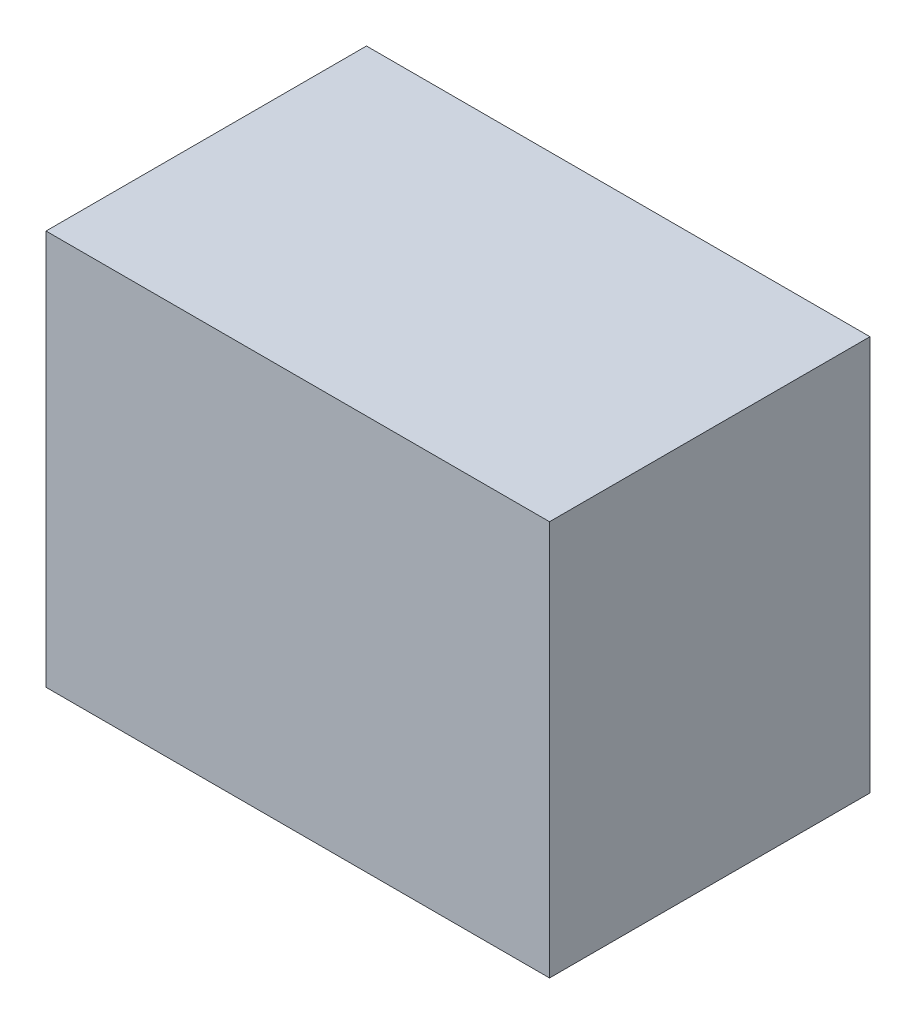
ISO-10303-21;
HEADER;
FILE_DESCRIPTION(('STEP AP214'),'2;1');
FILE_NAME('part.step','',(''),(''),'','','');
FILE_SCHEMA(('AUTOMOTIVE_DESIGN { 1 0 10303 214 1 1 1 1 }'));
ENDSEC;
DATA;
#1=APPLICATION_CONTEXT('core data for automotive mechanical design processes');
#2=APPLICATION_PROTOCOL_DEFINITION('international standard','automotive_design',2000,#1);
#3=PRODUCT_CONTEXT('',#1,'mechanical');
#4=PRODUCT('Part','Part','',(#3));
#5=PRODUCT_RELATED_PRODUCT_CATEGORY('part','',(#4));
#6=PRODUCT_DEFINITION_FORMATION('','',#4);
#7=PRODUCT_DEFINITION_CONTEXT('part definition',#1,'design');
#8=PRODUCT_DEFINITION('design','',#6,#7);
#9=PRODUCT_DEFINITION_SHAPE('','',#8);
#10=(LENGTH_UNIT() NAMED_UNIT(*) SI_UNIT(.MILLI.,.METRE.));
#11=(NAMED_UNIT(*) PLANE_ANGLE_UNIT() SI_UNIT($,.RADIAN.));
#12=(NAMED_UNIT(*) SI_UNIT($,.STERADIAN.) SOLID_ANGLE_UNIT());
#13=UNCERTAINTY_MEASURE_WITH_UNIT(LENGTH_MEASURE(1.E-05),#10,'distance_accuracy_value','');
#14=(GEOMETRIC_REPRESENTATION_CONTEXT(3) GLOBAL_UNCERTAINTY_ASSIGNED_CONTEXT((#13)) GLOBAL_UNIT_ASSIGNED_CONTEXT((#10,
#11,#12)) REPRESENTATION_CONTEXT('',''));
#15=CARTESIAN_POINT('',(0.,0.,0.));
#16=DIRECTION('',(0.,0.,1.));
#17=DIRECTION('',(1.,0.,0.));
#18=AXIS2_PLACEMENT_3D('',#15,#16,#17);
#19=CARTESIAN_POINT('',(27.3,42.85,17.375));
#20=DIRECTION('',(-1.,0.,0.));
#21=DIRECTION('',(0.,0.,1.));
#22=AXIS2_PLACEMENT_3D('',#19,#20,#21);
#23=PLANE('',#22);
#24=DIRECTION('',(0.,0.,-1.));
#25=VECTOR('',#24,1.);
#26=CARTESIAN_POINT('',(27.3,0.,17.375));
#27=LINE('',#26,#25);
#28=CARTESIAN_POINT('',(27.3,0.,17.375));
#29=VERTEX_POINT('',#28);
#30=CARTESIAN_POINT('',(27.3,0.,-17.375));
#31=VERTEX_POINT('',#30);
#32=EDGE_CURVE('E113',#29,#31,#27,.T.);
#33=ORIENTED_EDGE('',*,*,#32,.T.);
#34=DIRECTION('',(0.,-1.,0.));
#35=VECTOR('',#34,1.);
#36=CARTESIAN_POINT('',(27.3,42.85,-17.375));
#37=LINE('',#36,#35);
#38=CARTESIAN_POINT('',(27.3,42.85,-17.375));
#39=VERTEX_POINT('',#38);
#40=EDGE_CURVE('E11',#39,#31,#37,.T.);
#41=ORIENTED_EDGE('',*,*,#40,.F.);
#42=DIRECTION('',(0.,0.,-1.));
#43=VECTOR('',#42,1.);
#44=CARTESIAN_POINT('',(27.3,42.85,17.375));
#45=LINE('',#44,#43);
#46=CARTESIAN_POINT('',(27.3,42.85,17.375));
#47=VERTEX_POINT('',#46);
#48=EDGE_CURVE('E97',#47,#39,#45,.T.);
#49=ORIENTED_EDGE('',*,*,#48,.F.);
#50=DIRECTION('',(0.,-1.,0.));
#51=VECTOR('',#50,1.);
#52=CARTESIAN_POINT('',(27.3,42.85,17.375));
#53=LINE('',#52,#51);
#54=EDGE_CURVE('E109',#47,#29,#53,.T.);
#55=ORIENTED_EDGE('',*,*,#54,.T.);
#56=EDGE_LOOP('',(#33,#41,#49,#55));
#57=FACE_BOUND('',#56,.T.);
#58=ADVANCED_FACE('F45',(#57),#23,.F.);
#59=CARTESIAN_POINT('',(-27.3,42.85,-17.375));
#60=DIRECTION('',(0.,0.,1.));
#61=DIRECTION('',(1.,0.,0.));
#62=AXIS2_PLACEMENT_3D('',#59,#60,#61);
#63=PLANE('',#62);
#64=DIRECTION('',(-1.,0.,0.));
#65=VECTOR('',#64,1.);
#66=CARTESIAN_POINT('',(-27.3,0.,-17.375));
#67=LINE('',#66,#65);
#68=CARTESIAN_POINT('',(-27.3,0.,-17.375));
#69=VERTEX_POINT('',#68);
#70=EDGE_CURVE('E102',#31,#69,#67,.T.);
#71=ORIENTED_EDGE('',*,*,#70,.T.);
#72=DIRECTION('',(0.,-1.,0.));
#73=VECTOR('',#72,1.);
#74=CARTESIAN_POINT('',(-27.3,42.85,-17.375));
#75=LINE('',#74,#73);
#76=CARTESIAN_POINT('',(-27.3,42.85,-17.375));
#77=VERTEX_POINT('',#76);
#78=EDGE_CURVE('E54',#77,#69,#75,.T.);
#79=ORIENTED_EDGE('',*,*,#78,.F.);
#80=DIRECTION('',(-1.,0.,0.));
#81=VECTOR('',#80,1.);
#82=CARTESIAN_POINT('',(-27.3,42.85,-17.375));
#83=LINE('',#82,#81);
#84=EDGE_CURVE('E92',#39,#77,#83,.T.);
#85=ORIENTED_EDGE('',*,*,#84,.F.);
#86=ORIENTED_EDGE('',*,*,#40,.T.);
#87=EDGE_LOOP('',(#71,#79,#85,#86));
#88=FACE_BOUND('',#87,.T.);
#89=ADVANCED_FACE('F101',(#88),#63,.F.);
#90=CARTESIAN_POINT('',(-27.3,42.85,17.375));
#91=DIRECTION('',(1.,0.,0.));
#92=DIRECTION('',(0.,0.,-1.));
#93=AXIS2_PLACEMENT_3D('',#90,#91,#92);
#94=PLANE('',#93);
#95=DIRECTION('',(0.,0.,1.));
#96=VECTOR('',#95,1.);
#97=CARTESIAN_POINT('',(-27.3,0.,17.375));
#98=LINE('',#97,#96);
#99=CARTESIAN_POINT('',(-27.3,0.,17.375));
#100=VERTEX_POINT('',#99);
#101=EDGE_CURVE('E79',#69,#100,#98,.T.);
#102=ORIENTED_EDGE('',*,*,#101,.T.);
#103=DIRECTION('',(0.,-1.,0.));
#104=VECTOR('',#103,1.);
#105=CARTESIAN_POINT('',(-27.3,42.85,17.375));
#106=LINE('',#105,#104);
#107=CARTESIAN_POINT('',(-27.3,42.85,17.375));
#108=VERTEX_POINT('',#107);
#109=EDGE_CURVE('E104',#108,#100,#106,.T.);
#110=ORIENTED_EDGE('',*,*,#109,.F.);
#111=DIRECTION('',(0.,0.,1.));
#112=VECTOR('',#111,1.);
#113=CARTESIAN_POINT('',(-27.3,42.85,17.375));
#114=LINE('',#113,#112);
#115=EDGE_CURVE('E95',#77,#108,#114,.T.);
#116=ORIENTED_EDGE('',*,*,#115,.F.);
#117=ORIENTED_EDGE('',*,*,#78,.T.);
#118=EDGE_LOOP('',(#102,#110,#116,#117));
#119=FACE_BOUND('',#118,.T.);
#120=ADVANCED_FACE('F105',(#119),#94,.F.);
#121=CARTESIAN_POINT('',(-27.3,42.85,17.375));
#122=DIRECTION('',(0.,0.,-1.));
#123=DIRECTION('',(-1.,0.,0.));
#124=AXIS2_PLACEMENT_3D('',#121,#122,#123);
#125=PLANE('',#124);
#126=DIRECTION('',(1.,0.,0.));
#127=VECTOR('',#126,1.);
#128=CARTESIAN_POINT('',(-27.3,0.,17.375));
#129=LINE('',#128,#127);
#130=EDGE_CURVE('E85',#100,#29,#129,.T.);
#131=ORIENTED_EDGE('',*,*,#130,.T.);
#132=ORIENTED_EDGE('',*,*,#54,.F.);
#133=DIRECTION('',(1.,0.,0.));
#134=VECTOR('',#133,1.);
#135=CARTESIAN_POINT('',(-27.3,42.85,17.375));
#136=LINE('',#135,#134);
#137=EDGE_CURVE('E62',#108,#47,#136,.T.);
#138=ORIENTED_EDGE('',*,*,#137,.F.);
#139=ORIENTED_EDGE('',*,*,#109,.T.);
#140=EDGE_LOOP('',(#131,#132,#138,#139));
#141=FACE_BOUND('',#140,.T.);
#142=ADVANCED_FACE('F126',(#141),#125,.F.);
#143=CARTESIAN_POINT('',(0.,42.85,0.));
#144=DIRECTION('',(0.,-1.,0.));
#145=DIRECTION('',(0.,0.,-1.));
#146=AXIS2_PLACEMENT_3D('',#143,#144,#145);
#147=PLANE('',#146);
#148=ORIENTED_EDGE('',*,*,#48,.T.);
#149=ORIENTED_EDGE('',*,*,#84,.T.);
#150=ORIENTED_EDGE('',*,*,#115,.T.);
#151=ORIENTED_EDGE('',*,*,#137,.T.);
#152=EDGE_LOOP('',(#148,#149,#150,#151));
#153=FACE_BOUND('',#152,.T.);
#154=ADVANCED_FACE('F93',(#153),#147,.F.);
#155=CARTESIAN_POINT('',(0.,0.,0.));
#156=DIRECTION('',(0.,-1.,0.));
#157=DIRECTION('',(0.,0.,-1.));
#158=AXIS2_PLACEMENT_3D('',#155,#156,#157);
#159=PLANE('',#158);
#160=ORIENTED_EDGE('',*,*,#32,.F.);
#161=ORIENTED_EDGE('',*,*,#130,.F.);
#162=ORIENTED_EDGE('',*,*,#101,.F.);
#163=ORIENTED_EDGE('',*,*,#70,.F.);
#164=EDGE_LOOP('',(#160,#161,#162,#163));
#165=FACE_BOUND('',#164,.T.);
#166=ADVANCED_FACE('F129',(#165),#159,.T.);
#167=CLOSED_SHELL('',(#58,#89,#120,#142,#154,#166));
#168=MANIFOLD_SOLID_BREP('B2',#167);
#169=ADVANCED_BREP_SHAPE_REPRESENTATION('',(#18,#168),#14);
#170=SHAPE_DEFINITION_REPRESENTATION(#9,#169);
ENDSEC;
END-ISO-10303-21;
